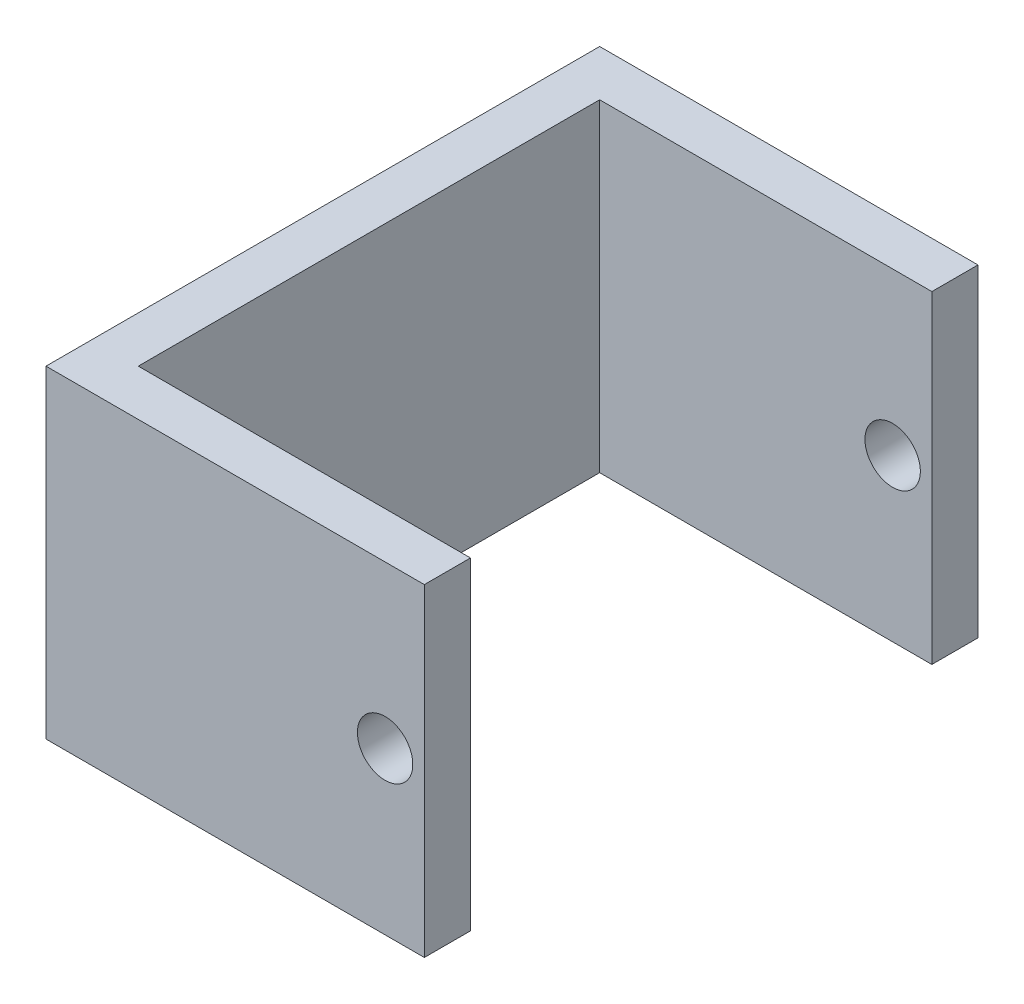
ISO-10303-21;
HEADER;
FILE_DESCRIPTION(('STEP AP214'),'2;1');
FILE_NAME('part.step','',(''),(''),'','','');
FILE_SCHEMA(('AUTOMOTIVE_DESIGN { 1 0 10303 214 1 1 1 1 }'));
ENDSEC;
DATA;
#1=APPLICATION_CONTEXT('core data for automotive mechanical design processes');
#2=APPLICATION_PROTOCOL_DEFINITION('international standard','automotive_design',2000,#1);
#3=PRODUCT_CONTEXT('',#1,'mechanical');
#4=PRODUCT('Part','Part','',(#3));
#5=PRODUCT_RELATED_PRODUCT_CATEGORY('part','',(#4));
#6=PRODUCT_DEFINITION_FORMATION('','',#4);
#7=PRODUCT_DEFINITION_CONTEXT('part definition',#1,'design');
#8=PRODUCT_DEFINITION('design','',#6,#7);
#9=PRODUCT_DEFINITION_SHAPE('','',#8);
#10=(LENGTH_UNIT() NAMED_UNIT(*) SI_UNIT(.MILLI.,.METRE.));
#11=(NAMED_UNIT(*) PLANE_ANGLE_UNIT() SI_UNIT($,.RADIAN.));
#12=(NAMED_UNIT(*) SI_UNIT($,.STERADIAN.) SOLID_ANGLE_UNIT());
#13=UNCERTAINTY_MEASURE_WITH_UNIT(LENGTH_MEASURE(1.E-05),#10,'distance_accuracy_value','');
#14=(GEOMETRIC_REPRESENTATION_CONTEXT(3) GLOBAL_UNCERTAINTY_ASSIGNED_CONTEXT((#13)) GLOBAL_UNIT_ASSIGNED_CONTEXT((#10,
#11,#12)) REPRESENTATION_CONTEXT('',''));
#15=CARTESIAN_POINT('',(0.,0.,0.));
#16=DIRECTION('',(0.,0.,1.));
#17=DIRECTION('',(1.,0.,0.));
#18=AXIS2_PLACEMENT_3D('',#15,#16,#17);
#19=CARTESIAN_POINT('',(10.,0.,0.));
#20=DIRECTION('',(-1.,0.,0.));
#21=DIRECTION('',(0.,0.,1.));
#22=AXIS2_PLACEMENT_3D('',#19,#20,#21);
#23=PLANE('',#22);
#24=DIRECTION('',(0.,1.,0.));
#25=VECTOR('',#24,1.);
#26=CARTESIAN_POINT('',(10.,-35.,50.));
#27=LINE('',#26,#25);
#28=CARTESIAN_POINT('',(10.,-35.,50.));
#29=VERTEX_POINT('',#28);
#30=CARTESIAN_POINT('',(10.,35.,50.));
#31=VERTEX_POINT('',#30);
#32=EDGE_CURVE('E62',#29,#31,#27,.T.);
#33=ORIENTED_EDGE('',*,*,#32,.F.);
#34=DIRECTION('',(0.,0.,-1.));
#35=VECTOR('',#34,1.);
#36=CARTESIAN_POINT('',(10.,-35.,-60.));
#37=LINE('',#36,#35);
#38=CARTESIAN_POINT('',(10.,-35.,-50.));
#39=VERTEX_POINT('',#38);
#40=EDGE_CURVE('E136',#29,#39,#37,.T.);
#41=ORIENTED_EDGE('',*,*,#40,.T.);
#42=DIRECTION('',(0.,-1.,0.));
#43=VECTOR('',#42,1.);
#44=CARTESIAN_POINT('',(10.,-35.,-50.));
#45=LINE('',#44,#43);
#46=CARTESIAN_POINT('',(10.,35.,-50.));
#47=VERTEX_POINT('',#46);
#48=EDGE_CURVE('E67',#47,#39,#45,.T.);
#49=ORIENTED_EDGE('',*,*,#48,.F.);
#50=DIRECTION('',(0.,0.,1.));
#51=VECTOR('',#50,1.);
#52=CARTESIAN_POINT('',(10.,35.,-60.));
#53=LINE('',#52,#51);
#54=EDGE_CURVE('E172',#47,#31,#53,.T.);
#55=ORIENTED_EDGE('',*,*,#54,.T.);
#56=EDGE_LOOP('',(#33,#41,#49,#55));
#57=FACE_BOUND('',#56,.T.);
#58=ADVANCED_FACE('F45',(#57),#23,.F.);
#59=CARTESIAN_POINT('',(10.,35.,-60.));
#60=DIRECTION('',(0.,-1.,0.));
#61=DIRECTION('',(0.,0.,-1.));
#62=AXIS2_PLACEMENT_3D('',#59,#60,#61);
#63=PLANE('',#62);
#64=DIRECTION('',(0.,0.,1.));
#65=VECTOR('',#64,1.);
#66=CARTESIAN_POINT('',(0.,35.,-60.));
#67=LINE('',#66,#65);
#68=CARTESIAN_POINT('',(0.,35.,-60.));
#69=VERTEX_POINT('',#68);
#70=CARTESIAN_POINT('',(0.,35.,60.));
#71=VERTEX_POINT('',#70);
#72=EDGE_CURVE('E138',#69,#71,#67,.T.);
#73=ORIENTED_EDGE('',*,*,#72,.T.);
#74=DIRECTION('',(-1.,0.,0.));
#75=VECTOR('',#74,1.);
#76=CARTESIAN_POINT('',(10.,35.,60.));
#77=LINE('',#76,#75);
#78=CARTESIAN_POINT('',(82.,35.,60.));
#79=VERTEX_POINT('',#78);
#80=EDGE_CURVE('E11',#79,#71,#77,.T.);
#81=ORIENTED_EDGE('',*,*,#80,.F.);
#82=DIRECTION('',(0.,0.,1.));
#83=VECTOR('',#82,1.);
#84=CARTESIAN_POINT('',(82.,35.,60.));
#85=LINE('',#84,#83);
#86=CARTESIAN_POINT('',(82.,35.,50.));
#87=VERTEX_POINT('',#86);
#88=EDGE_CURVE('E122',#87,#79,#85,.T.);
#89=ORIENTED_EDGE('',*,*,#88,.F.);
#90=DIRECTION('',(-1.,0.,0.));
#91=VECTOR('',#90,1.);
#92=CARTESIAN_POINT('',(82.,35.,50.));
#93=LINE('',#92,#91);
#94=EDGE_CURVE('E117',#87,#31,#93,.T.);
#95=ORIENTED_EDGE('',*,*,#94,.T.);
#96=ORIENTED_EDGE('',*,*,#54,.F.);
#97=DIRECTION('',(-1.,0.,0.));
#98=VECTOR('',#97,1.);
#99=CARTESIAN_POINT('',(82.,35.,-50.));
#100=LINE('',#99,#98);
#101=CARTESIAN_POINT('',(82.,35.,-50.));
#102=VERTEX_POINT('',#101);
#103=EDGE_CURVE('E148',#102,#47,#100,.T.);
#104=ORIENTED_EDGE('',*,*,#103,.F.);
#105=DIRECTION('',(0.,0.,1.));
#106=VECTOR('',#105,1.);
#107=CARTESIAN_POINT('',(82.,35.,-60.));
#108=LINE('',#107,#106);
#109=CARTESIAN_POINT('',(82.,35.,-60.));
#110=VERTEX_POINT('',#109);
#111=EDGE_CURVE('E166',#110,#102,#108,.T.);
#112=ORIENTED_EDGE('',*,*,#111,.F.);
#113=DIRECTION('',(-1.,0.,0.));
#114=VECTOR('',#113,1.);
#115=CARTESIAN_POINT('',(10.,35.,-60.));
#116=LINE('',#115,#114);
#117=EDGE_CURVE('E177',#110,#69,#116,.T.);
#118=ORIENTED_EDGE('',*,*,#117,.T.);
#119=EDGE_LOOP('',(#73,#81,#89,#95,#96,#104,#112,#118));
#120=FACE_BOUND('',#119,.T.);
#121=ADVANCED_FACE('F47',(#120),#63,.F.);
#122=CARTESIAN_POINT('',(10.,-35.,60.));
#123=DIRECTION('',(0.,0.,-1.));
#124=DIRECTION('',(-1.,0.,0.));
#125=AXIS2_PLACEMENT_3D('',#122,#123,#124);
#126=PLANE('',#125);
#127=CARTESIAN_POINT('',(73.5,0.,60.));
#128=DIRECTION('',(0.,0.,-1.));
#129=DIRECTION('',(-1.,0.,0.));
#130=AXIS2_PLACEMENT_3D('',#127,#128,#129);
#131=CIRCLE('',#130,6.);
#132=CARTESIAN_POINT('',(67.5,0.,60.));
#133=VERTEX_POINT('',#132);
#134=EDGE_CURVE('E243',#133,#133,#131,.T.);
#135=ORIENTED_EDGE('',*,*,#134,.T.);
#136=EDGE_LOOP('',(#135));
#137=FACE_BOUND('',#136,.T.);
#138=DIRECTION('',(0.,-1.,0.));
#139=VECTOR('',#138,1.);
#140=CARTESIAN_POINT('',(0.,-35.,60.));
#141=LINE('',#140,#139);
#142=CARTESIAN_POINT('',(0.,-35.,60.));
#143=VERTEX_POINT('',#142);
#144=EDGE_CURVE('E143',#71,#143,#141,.T.);
#145=ORIENTED_EDGE('',*,*,#144,.T.);
#146=DIRECTION('',(-1.,0.,0.));
#147=VECTOR('',#146,1.);
#148=CARTESIAN_POINT('',(10.,-35.,60.));
#149=LINE('',#148,#147);
#150=CARTESIAN_POINT('',(82.,-35.,60.));
#151=VERTEX_POINT('',#150);
#152=EDGE_CURVE('E55',#151,#143,#149,.T.);
#153=ORIENTED_EDGE('',*,*,#152,.F.);
#154=DIRECTION('',(0.,-1.,0.));
#155=VECTOR('',#154,1.);
#156=CARTESIAN_POINT('',(82.,-35.,60.));
#157=LINE('',#156,#155);
#158=EDGE_CURVE('E129',#79,#151,#157,.T.);
#159=ORIENTED_EDGE('',*,*,#158,.F.);
#160=ORIENTED_EDGE('',*,*,#80,.T.);
#161=EDGE_LOOP('',(#145,#153,#159,#160));
#162=FACE_BOUND('',#161,.T.);
#163=ADVANCED_FACE('F231',(#137,#162),#126,.F.);
#164=CARTESIAN_POINT('',(10.,-35.,-60.));
#165=DIRECTION('',(0.,1.,0.));
#166=DIRECTION('',(0.,0.,1.));
#167=AXIS2_PLACEMENT_3D('',#164,#165,#166);
#168=PLANE('',#167);
#169=DIRECTION('',(0.,0.,-1.));
#170=VECTOR('',#169,1.);
#171=CARTESIAN_POINT('',(0.,-35.,-60.));
#172=LINE('',#171,#170);
#173=CARTESIAN_POINT('',(0.,-35.,-60.));
#174=VERTEX_POINT('',#173);
#175=EDGE_CURVE('E181',#143,#174,#172,.T.);
#176=ORIENTED_EDGE('',*,*,#175,.T.);
#177=DIRECTION('',(-1.,0.,0.));
#178=VECTOR('',#177,1.);
#179=CARTESIAN_POINT('',(10.,-35.,-60.));
#180=LINE('',#179,#178);
#181=CARTESIAN_POINT('',(82.,-35.,-60.));
#182=VERTEX_POINT('',#181);
#183=EDGE_CURVE('E189',#182,#174,#180,.T.);
#184=ORIENTED_EDGE('',*,*,#183,.F.);
#185=DIRECTION('',(0.,0.,-1.));
#186=VECTOR('',#185,1.);
#187=CARTESIAN_POINT('',(82.,-35.,-60.));
#188=LINE('',#187,#186);
#189=CARTESIAN_POINT('',(82.,-35.,-50.));
#190=VERTEX_POINT('',#189);
#191=EDGE_CURVE('E156',#190,#182,#188,.T.);
#192=ORIENTED_EDGE('',*,*,#191,.F.);
#193=DIRECTION('',(-1.,0.,0.));
#194=VECTOR('',#193,1.);
#195=CARTESIAN_POINT('',(82.,-35.,-50.));
#196=LINE('',#195,#194);
#197=EDGE_CURVE('E152',#190,#39,#196,.T.);
#198=ORIENTED_EDGE('',*,*,#197,.T.);
#199=ORIENTED_EDGE('',*,*,#40,.F.);
#200=DIRECTION('',(-1.,0.,0.));
#201=VECTOR('',#200,1.);
#202=CARTESIAN_POINT('',(82.,-35.,50.));
#203=LINE('',#202,#201);
#204=CARTESIAN_POINT('',(82.,-35.,50.));
#205=VERTEX_POINT('',#204);
#206=EDGE_CURVE('E115',#205,#29,#203,.T.);
#207=ORIENTED_EDGE('',*,*,#206,.F.);
#208=DIRECTION('',(0.,0.,-1.));
#209=VECTOR('',#208,1.);
#210=CARTESIAN_POINT('',(82.,-35.,60.));
#211=LINE('',#210,#209);
#212=EDGE_CURVE('E123',#151,#205,#211,.T.);
#213=ORIENTED_EDGE('',*,*,#212,.F.);
#214=ORIENTED_EDGE('',*,*,#152,.T.);
#215=EDGE_LOOP('',(#176,#184,#192,#198,#199,#207,#213,#214));
#216=FACE_BOUND('',#215,.T.);
#217=ADVANCED_FACE('F134',(#216),#168,.F.);
#218=CARTESIAN_POINT('',(10.,-35.,-60.));
#219=DIRECTION('',(0.,0.,1.));
#220=DIRECTION('',(1.,0.,0.));
#221=AXIS2_PLACEMENT_3D('',#218,#219,#220);
#222=PLANE('',#221);
#223=CARTESIAN_POINT('',(73.5,0.,-60.));
#224=DIRECTION('',(0.,0.,1.));
#225=DIRECTION('',(1.,0.,0.));
#226=AXIS2_PLACEMENT_3D('',#223,#224,#225);
#227=CIRCLE('',#226,6.);
#228=CARTESIAN_POINT('',(79.5,0.,-60.));
#229=VERTEX_POINT('',#228);
#230=EDGE_CURVE('E153',#229,#229,#227,.T.);
#231=ORIENTED_EDGE('',*,*,#230,.T.);
#232=EDGE_LOOP('',(#231));
#233=FACE_BOUND('',#232,.T.);
#234=DIRECTION('',(0.,1.,0.));
#235=VECTOR('',#234,1.);
#236=CARTESIAN_POINT('',(0.,-35.,-60.));
#237=LINE('',#236,#235);
#238=EDGE_CURVE('E175',#174,#69,#237,.T.);
#239=ORIENTED_EDGE('',*,*,#238,.T.);
#240=ORIENTED_EDGE('',*,*,#117,.F.);
#241=DIRECTION('',(0.,1.,0.));
#242=VECTOR('',#241,1.);
#243=CARTESIAN_POINT('',(82.,-35.,-60.));
#244=LINE('',#243,#242);
#245=EDGE_CURVE('E159',#182,#110,#244,.T.);
#246=ORIENTED_EDGE('',*,*,#245,.F.);
#247=ORIENTED_EDGE('',*,*,#183,.T.);
#248=EDGE_LOOP('',(#239,#240,#246,#247));
#249=FACE_BOUND('',#248,.T.);
#250=ADVANCED_FACE('F201',(#233,#249),#222,.F.);
#251=CARTESIAN_POINT('',(0.,0.,0.));
#252=DIRECTION('',(-1.,0.,0.));
#253=DIRECTION('',(0.,0.,1.));
#254=AXIS2_PLACEMENT_3D('',#251,#252,#253);
#255=PLANE('',#254);
#256=ORIENTED_EDGE('',*,*,#72,.F.);
#257=ORIENTED_EDGE('',*,*,#238,.F.);
#258=ORIENTED_EDGE('',*,*,#175,.F.);
#259=ORIENTED_EDGE('',*,*,#144,.F.);
#260=EDGE_LOOP('',(#256,#257,#258,#259));
#261=FACE_BOUND('',#260,.T.);
#262=ADVANCED_FACE('F199',(#261),#255,.T.);
#263=CARTESIAN_POINT('',(82.,-35.,-50.));
#264=DIRECTION('',(0.,0.,-1.));
#265=DIRECTION('',(-1.,0.,0.));
#266=AXIS2_PLACEMENT_3D('',#263,#264,#265);
#267=PLANE('',#266);
#268=CARTESIAN_POINT('',(73.5,0.,-50.));
#269=DIRECTION('',(0.,0.,-1.));
#270=DIRECTION('',(-1.,0.,0.));
#271=AXIS2_PLACEMENT_3D('',#268,#269,#270);
#272=CIRCLE('',#271,6.);
#273=CARTESIAN_POINT('',(67.5,0.,-50.));
#274=VERTEX_POINT('',#273);
#275=EDGE_CURVE('E252',#274,#274,#272,.T.);
#276=ORIENTED_EDGE('',*,*,#275,.T.);
#277=EDGE_LOOP('',(#276));
#278=FACE_BOUND('',#277,.T.);
#279=ORIENTED_EDGE('',*,*,#48,.T.);
#280=ORIENTED_EDGE('',*,*,#197,.F.);
#281=DIRECTION('',(0.,-1.,0.));
#282=VECTOR('',#281,1.);
#283=CARTESIAN_POINT('',(82.,-35.,-50.));
#284=LINE('',#283,#282);
#285=EDGE_CURVE('E163',#102,#190,#284,.T.);
#286=ORIENTED_EDGE('',*,*,#285,.F.);
#287=ORIENTED_EDGE('',*,*,#103,.T.);
#288=EDGE_LOOP('',(#279,#280,#286,#287));
#289=FACE_BOUND('',#288,.T.);
#290=ADVANCED_FACE('F212',(#278,#289),#267,.F.);
#291=CARTESIAN_POINT('',(82.,0.,0.));
#292=DIRECTION('',(1.,0.,0.));
#293=DIRECTION('',(0.,0.,-1.));
#294=AXIS2_PLACEMENT_3D('',#291,#292,#293);
#295=PLANE('',#294);
#296=ORIENTED_EDGE('',*,*,#245,.T.);
#297=ORIENTED_EDGE('',*,*,#111,.T.);
#298=ORIENTED_EDGE('',*,*,#285,.T.);
#299=ORIENTED_EDGE('',*,*,#191,.T.);
#300=EDGE_LOOP('',(#296,#297,#298,#299));
#301=FACE_BOUND('',#300,.T.);
#302=ADVANCED_FACE('F208',(#301),#295,.T.);
#303=CARTESIAN_POINT('',(82.,-35.,50.));
#304=DIRECTION('',(0.,0.,1.));
#305=DIRECTION('',(1.,0.,0.));
#306=AXIS2_PLACEMENT_3D('',#303,#304,#305);
#307=PLANE('',#306);
#308=CARTESIAN_POINT('',(73.5,0.,50.));
#309=DIRECTION('',(0.,0.,1.));
#310=DIRECTION('',(1.,0.,0.));
#311=AXIS2_PLACEMENT_3D('',#308,#309,#310);
#312=CIRCLE('',#311,6.);
#313=CARTESIAN_POINT('',(79.5,0.,50.));
#314=VERTEX_POINT('',#313);
#315=EDGE_CURVE('E49',#314,#314,#312,.T.);
#316=ORIENTED_EDGE('',*,*,#315,.T.);
#317=EDGE_LOOP('',(#316));
#318=FACE_BOUND('',#317,.T.);
#319=ORIENTED_EDGE('',*,*,#32,.T.);
#320=ORIENTED_EDGE('',*,*,#94,.F.);
#321=DIRECTION('',(0.,1.,0.));
#322=VECTOR('',#321,1.);
#323=CARTESIAN_POINT('',(82.,-35.,50.));
#324=LINE('',#323,#322);
#325=EDGE_CURVE('E111',#205,#87,#324,.T.);
#326=ORIENTED_EDGE('',*,*,#325,.F.);
#327=ORIENTED_EDGE('',*,*,#206,.T.);
#328=EDGE_LOOP('',(#319,#320,#326,#327));
#329=FACE_BOUND('',#328,.T.);
#330=ADVANCED_FACE('F113',(#318,#329),#307,.F.);
#331=CARTESIAN_POINT('',(82.,0.,0.));
#332=DIRECTION('',(1.,0.,0.));
#333=DIRECTION('',(0.,0.,-1.));
#334=AXIS2_PLACEMENT_3D('',#331,#332,#333);
#335=PLANE('',#334);
#336=ORIENTED_EDGE('',*,*,#212,.T.);
#337=ORIENTED_EDGE('',*,*,#325,.T.);
#338=ORIENTED_EDGE('',*,*,#88,.T.);
#339=ORIENTED_EDGE('',*,*,#158,.T.);
#340=EDGE_LOOP('',(#336,#337,#338,#339));
#341=FACE_BOUND('',#340,.T.);
#342=ADVANCED_FACE('F127',(#341),#335,.T.);
#343=CARTESIAN_POINT('',(73.5,0.,60.));
#344=DIRECTION('',(0.,0.,-1.));
#345=DIRECTION('',(-1.,0.,0.));
#346=AXIS2_PLACEMENT_3D('',#343,#344,#345);
#347=CYLINDRICAL_SURFACE('',#346,6.);
#348=ORIENTED_EDGE('',*,*,#134,.F.);
#349=EDGE_LOOP('',(#348));
#350=FACE_BOUND('',#349,.T.);
#351=ORIENTED_EDGE('',*,*,#315,.F.);
#352=EDGE_LOOP('',(#351));
#353=FACE_BOUND('',#352,.T.);
#354=ADVANCED_FACE('F262',(#350,#353),#347,.F.);
#355=ORIENTED_EDGE('',*,*,#275,.F.);
#356=EDGE_LOOP('',(#355));
#357=FACE_BOUND('',#356,.T.);
#358=ORIENTED_EDGE('',*,*,#230,.F.);
#359=EDGE_LOOP('',(#358));
#360=FACE_BOUND('',#359,.T.);
#361=ADVANCED_FACE('F264',(#357,#360),#347,.F.);
#362=CLOSED_SHELL('',(#58,#121,#163,#217,#250,#262,#290,#302,#330,#342,#354,#361));
#363=MANIFOLD_SOLID_BREP('B2',#362);
#364=ADVANCED_BREP_SHAPE_REPRESENTATION('',(#18,#363),#14);
#365=SHAPE_DEFINITION_REPRESENTATION(#9,#364);
ENDSEC;
END-ISO-10303-21;
